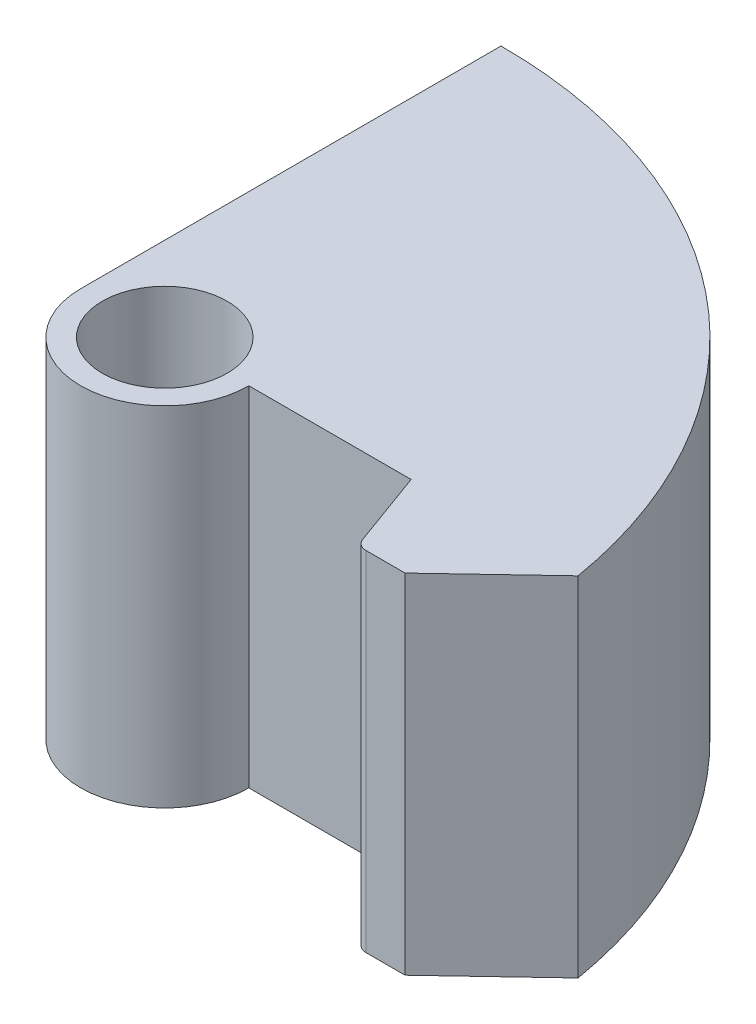
ISO-10303-21;
HEADER;
FILE_DESCRIPTION(('STEP AP214'),'2;1');
FILE_NAME('part.step','',(''),(''),'','','');
FILE_SCHEMA(('AUTOMOTIVE_DESIGN { 1 0 10303 214 1 1 1 1 }'));
ENDSEC;
DATA;
#1=APPLICATION_CONTEXT('core data for automotive mechanical design processes');
#2=APPLICATION_PROTOCOL_DEFINITION('international standard','automotive_design',2000,#1);
#3=PRODUCT_CONTEXT('',#1,'mechanical');
#4=PRODUCT('Part','Part','',(#3));
#5=PRODUCT_RELATED_PRODUCT_CATEGORY('part','',(#4));
#6=PRODUCT_DEFINITION_FORMATION('','',#4);
#7=PRODUCT_DEFINITION_CONTEXT('part definition',#1,'design');
#8=PRODUCT_DEFINITION('design','',#6,#7);
#9=PRODUCT_DEFINITION_SHAPE('','',#8);
#10=(LENGTH_UNIT() NAMED_UNIT(*) SI_UNIT(.MILLI.,.METRE.));
#11=(NAMED_UNIT(*) PLANE_ANGLE_UNIT() SI_UNIT($,.RADIAN.));
#12=(NAMED_UNIT(*) SI_UNIT($,.STERADIAN.) SOLID_ANGLE_UNIT());
#13=UNCERTAINTY_MEASURE_WITH_UNIT(LENGTH_MEASURE(1.E-05),#10,'distance_accuracy_value','');
#14=(GEOMETRIC_REPRESENTATION_CONTEXT(3) GLOBAL_UNCERTAINTY_ASSIGNED_CONTEXT((#13)) GLOBAL_UNIT_ASSIGNED_CONTEXT((#10,
#11,#12)) REPRESENTATION_CONTEXT('',''));
#15=CARTESIAN_POINT('',(0.,0.,0.));
#16=DIRECTION('',(0.,0.,1.));
#17=DIRECTION('',(1.,0.,0.));
#18=AXIS2_PLACEMENT_3D('',#15,#16,#17);
#19=CARTESIAN_POINT('',(0.,14.6,0.));
#20=DIRECTION('',(0.,0.,-1.));
#21=DIRECTION('',(-1.,0.,0.));
#22=AXIS2_PLACEMENT_3D('',#19,#20,#21);
#23=PLANE('',#22);
#24=DIRECTION('',(1.,0.,0.));
#25=VECTOR('',#24,1.);
#26=CARTESIAN_POINT('',(0.,0.,0.));
#27=LINE('',#26,#25);
#28=CARTESIAN_POINT('',(3.5,0.,0.));
#29=VERTEX_POINT('',#28);
#30=CARTESIAN_POINT('',(10.2570123290792,0.,0.));
#31=VERTEX_POINT('',#30);
#32=EDGE_CURVE('E239',#29,#31,#27,.T.);
#33=ORIENTED_EDGE('',*,*,#32,.T.);
#34=DIRECTION('',(0.,-1.,0.));
#35=VECTOR('',#34,1.);
#36=CARTESIAN_POINT('',(10.2570123290792,22.2808939467784,0.));
#37=LINE('',#36,#35);
#38=CARTESIAN_POINT('',(10.2570123290792,14.5,0.));
#39=VERTEX_POINT('',#38);
#40=EDGE_CURVE('E230',#39,#31,#37,.T.);
#41=ORIENTED_EDGE('',*,*,#40,.F.);
#42=DIRECTION('',(1.,0.,0.));
#43=VECTOR('',#42,1.);
#44=CARTESIAN_POINT('',(0.,14.5,0.));
#45=LINE('',#44,#43);
#46=CARTESIAN_POINT('',(3.5,14.5,0.));
#47=VERTEX_POINT('',#46);
#48=EDGE_CURVE('E237',#47,#39,#45,.T.);
#49=ORIENTED_EDGE('',*,*,#48,.F.);
#50=DIRECTION('',(0.,-1.,0.));
#51=VECTOR('',#50,1.);
#52=CARTESIAN_POINT('',(3.5,14.6,0.));
#53=LINE('',#52,#51);
#54=EDGE_CURVE('E183',#47,#29,#53,.T.);
#55=ORIENTED_EDGE('',*,*,#54,.T.);
#56=EDGE_LOOP('',(#33,#41,#49,#55));
#57=FACE_BOUND('',#56,.T.);
#58=ADVANCED_FACE('F160',(#57),#23,.F.);
#59=CARTESIAN_POINT('',(-3.5,14.6,3.5));
#60=DIRECTION('',(0.,-1.,0.));
#61=DIRECTION('',(0.,0.,-1.));
#62=AXIS2_PLACEMENT_3D('',#59,#60,#61);
#63=CYLINDRICAL_SURFACE('',#62,21.);
#64=CARTESIAN_POINT('',(-3.5,14.5,3.5));
#65=DIRECTION('',(0.,1.,0.));
#66=DIRECTION('',(0.,0.,1.));
#67=AXIS2_PLACEMENT_3D('',#64,#65,#66);
#68=CIRCLE('',#67,21.);
#69=CARTESIAN_POINT('',(17.2062792408487,14.5,0.));
#70=VERTEX_POINT('',#69);
#71=CARTESIAN_POINT('',(-3.5,14.5,-17.5));
#72=VERTEX_POINT('',#71);
#73=EDGE_CURVE('E244',#70,#72,#68,.T.);
#74=ORIENTED_EDGE('',*,*,#73,.F.);
#75=DIRECTION('',(0.,-1.,0.));
#76=VECTOR('',#75,1.);
#77=CARTESIAN_POINT('',(17.2062792408487,14.6,0.));
#78=LINE('',#77,#76);
#79=CARTESIAN_POINT('',(17.2062792408487,0.,0.));
#80=VERTEX_POINT('',#79);
#81=EDGE_CURVE('E12',#70,#80,#78,.T.);
#82=ORIENTED_EDGE('',*,*,#81,.T.);
#83=CARTESIAN_POINT('',(-3.5,0.,3.5));
#84=DIRECTION('',(0.,1.,0.));
#85=DIRECTION('',(0.,0.,1.));
#86=AXIS2_PLACEMENT_3D('',#83,#84,#85);
#87=CIRCLE('',#86,21.);
#88=CARTESIAN_POINT('',(-3.5,0.,-17.5));
#89=VERTEX_POINT('',#88);
#90=EDGE_CURVE('E246',#80,#89,#87,.T.);
#91=ORIENTED_EDGE('',*,*,#90,.T.);
#92=DIRECTION('',(0.,-1.,0.));
#93=VECTOR('',#92,1.);
#94=CARTESIAN_POINT('',(-3.5,14.6,-17.5));
#95=LINE('',#94,#93);
#96=EDGE_CURVE('E168',#72,#89,#95,.T.);
#97=ORIENTED_EDGE('',*,*,#96,.F.);
#98=EDGE_LOOP('',(#74,#82,#91,#97));
#99=FACE_BOUND('',#98,.T.);
#100=ADVANCED_FACE('F272',(#99),#63,.T.);
#101=CARTESIAN_POINT('',(-3.5,14.6,0.));
#102=DIRECTION('',(-1.,0.,0.));
#103=DIRECTION('',(0.,0.,1.));
#104=AXIS2_PLACEMENT_3D('',#101,#102,#103);
#105=PLANE('',#104);
#106=DIRECTION('',(0.,-1.,0.));
#107=VECTOR('',#106,1.);
#108=CARTESIAN_POINT('',(-3.5,14.6,0.));
#109=LINE('',#108,#107);
#110=CARTESIAN_POINT('',(-3.5,14.5,0.));
#111=VERTEX_POINT('',#110);
#112=CARTESIAN_POINT('',(-3.5,0.,0.));
#113=VERTEX_POINT('',#112);
#114=EDGE_CURVE('E262',#111,#113,#109,.T.);
#115=ORIENTED_EDGE('',*,*,#114,.F.);
#116=DIRECTION('',(0.,0.,-1.));
#117=VECTOR('',#116,1.);
#118=CARTESIAN_POINT('',(-3.5,14.5,0.));
#119=LINE('',#118,#117);
#120=EDGE_CURVE('E175',#111,#72,#119,.T.);
#121=ORIENTED_EDGE('',*,*,#120,.T.);
#122=ORIENTED_EDGE('',*,*,#96,.T.);
#123=DIRECTION('',(0.,0.,-1.));
#124=VECTOR('',#123,1.);
#125=CARTESIAN_POINT('',(-3.5,0.,0.));
#126=LINE('',#125,#124);
#127=EDGE_CURVE('E253',#113,#89,#126,.T.);
#128=ORIENTED_EDGE('',*,*,#127,.F.);
#129=EDGE_LOOP('',(#115,#121,#122,#128));
#130=FACE_BOUND('',#129,.T.);
#131=ADVANCED_FACE('F268',(#130),#105,.T.);
#132=CARTESIAN_POINT('',(0.,14.6,0.));
#133=DIRECTION('',(0.,-1.,0.));
#134=DIRECTION('',(0.,0.,-1.));
#135=AXIS2_PLACEMENT_3D('',#132,#133,#134);
#136=CYLINDRICAL_SURFACE('',#135,3.5);
#137=CARTESIAN_POINT('',(0.,14.5,0.));
#138=DIRECTION('',(0.,1.,0.));
#139=DIRECTION('',(0.,0.,1.));
#140=AXIS2_PLACEMENT_3D('',#137,#138,#139);
#141=CIRCLE('',#140,3.5);
#142=EDGE_CURVE('E243',#111,#47,#141,.T.);
#143=ORIENTED_EDGE('',*,*,#142,.F.);
#144=ORIENTED_EDGE('',*,*,#114,.T.);
#145=CARTESIAN_POINT('',(0.,0.,0.));
#146=DIRECTION('',(0.,1.,0.));
#147=DIRECTION('',(0.,0.,1.));
#148=AXIS2_PLACEMENT_3D('',#145,#146,#147);
#149=CIRCLE('',#148,3.5);
#150=EDGE_CURVE('E256',#113,#29,#149,.T.);
#151=ORIENTED_EDGE('',*,*,#150,.T.);
#152=ORIENTED_EDGE('',*,*,#54,.F.);
#153=EDGE_LOOP('',(#143,#144,#151,#152));
#154=FACE_BOUND('',#153,.T.);
#155=ADVANCED_FACE('F279',(#154),#136,.T.);
#156=CARTESIAN_POINT('',(0.,14.6,0.));
#157=DIRECTION('',(0.,-1.,0.));
#158=DIRECTION('',(0.,0.,-1.));
#159=AXIS2_PLACEMENT_3D('',#156,#157,#158);
#160=CYLINDRICAL_SURFACE('',#159,2.6);
#161=CARTESIAN_POINT('',(0.,0.,0.));
#162=DIRECTION('',(0.,1.,0.));
#163=DIRECTION('',(0.,0.,1.));
#164=AXIS2_PLACEMENT_3D('',#161,#162,#163);
#165=CIRCLE('',#164,2.6);
#166=CARTESIAN_POINT('',(0.,0.,2.6));
#167=VERTEX_POINT('',#166);
#168=EDGE_CURVE('E258',#167,#167,#165,.T.);
#169=ORIENTED_EDGE('',*,*,#168,.F.);
#170=EDGE_LOOP('',(#169));
#171=FACE_BOUND('',#170,.T.);
#172=CARTESIAN_POINT('',(0.,14.5,0.));
#173=DIRECTION('',(0.,1.,0.));
#174=DIRECTION('',(0.,0.,1.));
#175=AXIS2_PLACEMENT_3D('',#172,#173,#174);
#176=CIRCLE('',#175,2.6);
#177=CARTESIAN_POINT('',(0.,14.5,2.6));
#178=VERTEX_POINT('',#177);
#179=EDGE_CURVE('E163',#178,#178,#176,.T.);
#180=ORIENTED_EDGE('',*,*,#179,.T.);
#181=EDGE_LOOP('',(#180));
#182=FACE_BOUND('',#181,.T.);
#183=ADVANCED_FACE('F333',(#171,#182),#160,.F.);
#184=CARTESIAN_POINT('',(0.,0.,0.));
#185=DIRECTION('',(0.,1.,0.));
#186=DIRECTION('',(0.,0.,1.));
#187=AXIS2_PLACEMENT_3D('',#184,#185,#186);
#188=PLANE('',#187);
#189=ORIENTED_EDGE('',*,*,#32,.F.);
#190=ORIENTED_EDGE('',*,*,#150,.F.);
#191=ORIENTED_EDGE('',*,*,#127,.T.);
#192=ORIENTED_EDGE('',*,*,#90,.F.);
#193=DIRECTION('',(-0.726585931432191,0.,0.687075603005096));
#194=VECTOR('',#193,1.);
#195=CARTESIAN_POINT('',(8.12261786834912,0.,8.58970955121868));
#196=LINE('',#195,#194);
#197=CARTESIAN_POINT('',(13.5050115071524,0.,3.5));
#198=VERTEX_POINT('',#197);
#199=EDGE_CURVE('E235',#80,#198,#196,.T.);
#200=ORIENTED_EDGE('',*,*,#199,.T.);
#201=DIRECTION('',(1.,0.,0.));
#202=VECTOR('',#201,1.);
#203=CARTESIAN_POINT('',(0.,0.,3.5));
#204=LINE('',#203,#202);
#205=CARTESIAN_POINT('',(11.8810119181158,0.,3.5));
#206=VERTEX_POINT('',#205);
#207=EDGE_CURVE('E284',#206,#198,#204,.T.);
#208=ORIENTED_EDGE('',*,*,#207,.F.);
#209=CARTESIAN_POINT('',(11.8810119181158,0.,3.));
#210=DIRECTION('',(0.,-1.,0.));
#211=DIRECTION('',(0.,0.,-1.));
#212=AXIS2_PLACEMENT_3D('',#209,#210,#211);
#213=CIRCLE('',#212,0.500000000000001);
#214=CARTESIAN_POINT('',(11.4111656077229,0.,3.17101007166284));
#215=VERTEX_POINT('',#214);
#216=EDGE_CURVE('E282',#215,#206,#213,.F.);
#217=ORIENTED_EDGE('',*,*,#216,.F.);
#218=DIRECTION('',(-0.342020143325672,0.,-0.939692620785907));
#219=VECTOR('',#218,1.);
#220=CARTESIAN_POINT('',(9.05716981338658,0.,-3.29654021876713));
#221=LINE('',#220,#219);
#222=EDGE_CURVE('E294',#215,#31,#221,.T.);
#223=ORIENTED_EDGE('',*,*,#222,.T.);
#224=EDGE_LOOP('',(#189,#190,#191,#192,#200,#208,#217,#223));
#225=FACE_BOUND('',#224,.T.);
#226=ORIENTED_EDGE('',*,*,#168,.T.);
#227=EDGE_LOOP('',(#226));
#228=FACE_BOUND('',#227,.T.);
#229=ADVANCED_FACE('F276',(#225,#228),#188,.F.);
#230=CARTESIAN_POINT('',(0.,14.5,0.));
#231=DIRECTION('',(0.,1.,0.));
#232=DIRECTION('',(0.,0.,1.));
#233=AXIS2_PLACEMENT_3D('',#230,#231,#232);
#234=PLANE('',#233);
#235=ORIENTED_EDGE('',*,*,#179,.F.);
#236=EDGE_LOOP('',(#235));
#237=FACE_BOUND('',#236,.T.);
#238=ORIENTED_EDGE('',*,*,#48,.T.);
#239=DIRECTION('',(-0.342020143325672,0.,-0.939692620785907));
#240=VECTOR('',#239,1.);
#241=CARTESIAN_POINT('',(9.05716981338658,14.5,-3.29654021876713));
#242=LINE('',#241,#240);
#243=CARTESIAN_POINT('',(11.4111656077229,14.5,3.17101007166284));
#244=VERTEX_POINT('',#243);
#245=EDGE_CURVE('E226',#244,#39,#242,.T.);
#246=ORIENTED_EDGE('',*,*,#245,.F.);
#247=CARTESIAN_POINT('',(11.8810119181158,14.5,3.));
#248=DIRECTION('',(0.,1.,0.));
#249=DIRECTION('',(0.,0.,1.));
#250=AXIS2_PLACEMENT_3D('',#247,#248,#249);
#251=CIRCLE('',#250,0.500000000000001);
#252=CARTESIAN_POINT('',(11.8810119181158,14.5,3.5));
#253=VERTEX_POINT('',#252);
#254=EDGE_CURVE('E295',#244,#253,#251,.T.);
#255=ORIENTED_EDGE('',*,*,#254,.T.);
#256=DIRECTION('',(1.,0.,0.));
#257=VECTOR('',#256,1.);
#258=CARTESIAN_POINT('',(0.,14.5,3.5));
#259=LINE('',#258,#257);
#260=CARTESIAN_POINT('',(13.5050115071524,14.5,3.5));
#261=VERTEX_POINT('',#260);
#262=EDGE_CURVE('E292',#253,#261,#259,.T.);
#263=ORIENTED_EDGE('',*,*,#262,.T.);
#264=DIRECTION('',(-0.726585931432191,0.,0.687075603005096));
#265=VECTOR('',#264,1.);
#266=CARTESIAN_POINT('',(8.12261786834912,14.5,8.58970955121868));
#267=LINE('',#266,#265);
#268=EDGE_CURVE('E240',#70,#261,#267,.T.);
#269=ORIENTED_EDGE('',*,*,#268,.F.);
#270=ORIENTED_EDGE('',*,*,#73,.T.);
#271=ORIENTED_EDGE('',*,*,#120,.F.);
#272=ORIENTED_EDGE('',*,*,#142,.T.);
#273=EDGE_LOOP('',(#238,#246,#255,#263,#269,#270,#271,#272));
#274=FACE_BOUND('',#273,.T.);
#275=ADVANCED_FACE('F242',(#237,#274),#234,.T.);
#276=CARTESIAN_POINT('',(9.05716981338658,22.2808939467784,-3.29654021876713));
#277=DIRECTION('',(-0.939692620785907,0.,0.342020143325672));
#278=DIRECTION('',(0.342020143325672,0.,0.939692620785907));
#279=AXIS2_PLACEMENT_3D('',#276,#277,#278);
#280=PLANE('',#279);
#281=DIRECTION('',(0.,-1.,0.));
#282=VECTOR('',#281,1.);
#283=CARTESIAN_POINT('',(11.4111656077229,22.2808939467784,3.17101007166284));
#284=LINE('',#283,#282);
#285=EDGE_CURVE('E232',#244,#215,#284,.T.);
#286=ORIENTED_EDGE('',*,*,#285,.F.);
#287=ORIENTED_EDGE('',*,*,#245,.T.);
#288=ORIENTED_EDGE('',*,*,#40,.T.);
#289=ORIENTED_EDGE('',*,*,#222,.F.);
#290=EDGE_LOOP('',(#286,#287,#288,#289));
#291=FACE_BOUND('',#290,.T.);
#292=ADVANCED_FACE('F228',(#291),#280,.T.);
#293=CARTESIAN_POINT('',(8.12261786834912,22.2808939467784,8.58970955121868));
#294=DIRECTION('',(0.687075603005095,0.,0.726585931432191));
#295=DIRECTION('',(0.726585931432191,0.,-0.687075603005096));
#296=AXIS2_PLACEMENT_3D('',#293,#294,#295);
#297=PLANE('',#296);
#298=ORIENTED_EDGE('',*,*,#81,.F.);
#299=ORIENTED_EDGE('',*,*,#268,.T.);
#300=DIRECTION('',(0.,-1.,0.));
#301=VECTOR('',#300,1.);
#302=CARTESIAN_POINT('',(13.5050115071524,22.2808939467784,3.5));
#303=LINE('',#302,#301);
#304=EDGE_CURVE('E286',#261,#198,#303,.T.);
#305=ORIENTED_EDGE('',*,*,#304,.T.);
#306=ORIENTED_EDGE('',*,*,#199,.F.);
#307=EDGE_LOOP('',(#298,#299,#305,#306));
#308=FACE_BOUND('',#307,.T.);
#309=ADVANCED_FACE('F310',(#308),#297,.T.);
#310=CARTESIAN_POINT('',(0.,22.2808939467784,3.5));
#311=DIRECTION('',(0.,0.,-1.));
#312=DIRECTION('',(-1.,0.,0.));
#313=AXIS2_PLACEMENT_3D('',#310,#311,#312);
#314=PLANE('',#313);
#315=ORIENTED_EDGE('',*,*,#262,.F.);
#316=DIRECTION('',(0.,-1.,0.));
#317=VECTOR('',#316,1.);
#318=CARTESIAN_POINT('',(11.8810119181158,22.2808939467784,3.5));
#319=LINE('',#318,#317);
#320=EDGE_CURVE('E288',#253,#206,#319,.T.);
#321=ORIENTED_EDGE('',*,*,#320,.T.);
#322=ORIENTED_EDGE('',*,*,#207,.T.);
#323=ORIENTED_EDGE('',*,*,#304,.F.);
#324=EDGE_LOOP('',(#315,#321,#322,#323));
#325=FACE_BOUND('',#324,.T.);
#326=ADVANCED_FACE('F306',(#325),#314,.F.);
#327=CARTESIAN_POINT('',(11.8810119181158,22.2808939467784,3.));
#328=DIRECTION('',(0.,-1.,0.));
#329=DIRECTION('',(0.,0.,-1.));
#330=AXIS2_PLACEMENT_3D('',#327,#328,#329);
#331=CYLINDRICAL_SURFACE('',#330,0.500000000000001);
#332=ORIENTED_EDGE('',*,*,#254,.F.);
#333=ORIENTED_EDGE('',*,*,#285,.T.);
#334=ORIENTED_EDGE('',*,*,#216,.T.);
#335=ORIENTED_EDGE('',*,*,#320,.F.);
#336=EDGE_LOOP('',(#332,#333,#334,#335));
#337=FACE_BOUND('',#336,.T.);
#338=ADVANCED_FACE('F313',(#337),#331,.T.);
#339=CLOSED_SHELL('',(#58,#100,#131,#155,#183,#229,#275,#292,#309,#326,#338));
#340=MANIFOLD_SOLID_BREP('B2',#339);
#341=ADVANCED_BREP_SHAPE_REPRESENTATION('',(#18,#340),#14);
#342=SHAPE_DEFINITION_REPRESENTATION(#9,#341);
ENDSEC;
END-ISO-10303-21;
